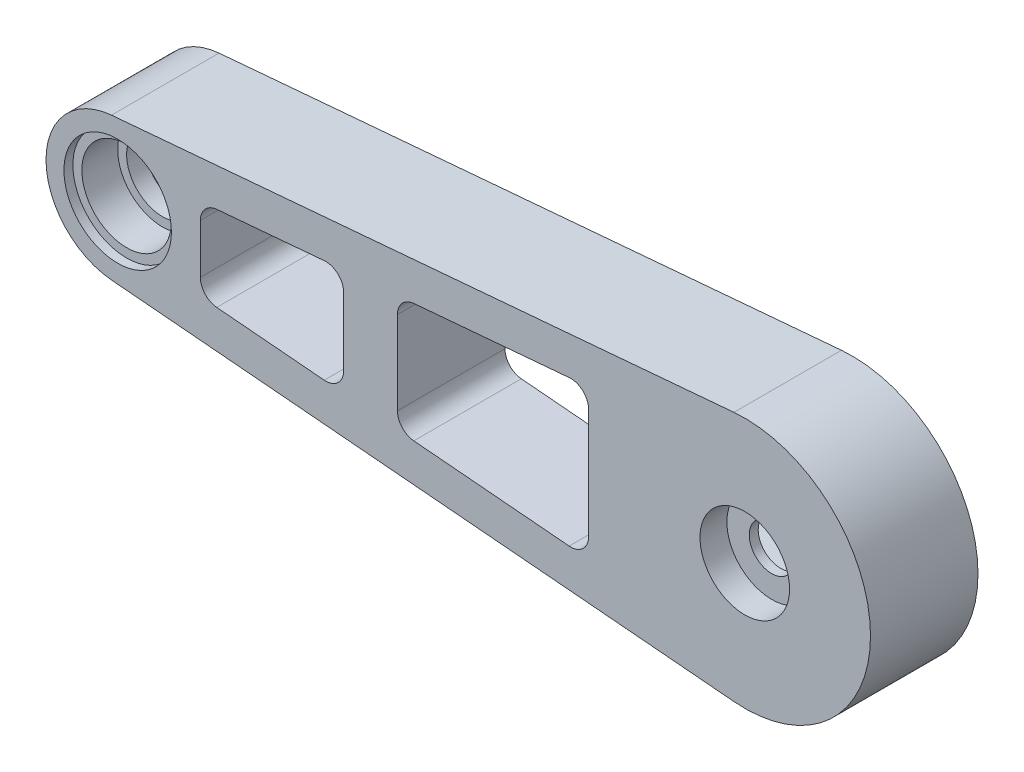
ISO-10303-21;
HEADER;
FILE_DESCRIPTION(('STEP AP214'),'2;1');
FILE_NAME('part.step','',(''),(''),'','','');
FILE_SCHEMA(('AUTOMOTIVE_DESIGN { 1 0 10303 214 1 1 1 1 }'));
ENDSEC;
DATA;
#1=APPLICATION_CONTEXT('core data for automotive mechanical design processes');
#2=APPLICATION_PROTOCOL_DEFINITION('international standard','automotive_design',2000,#1);
#3=PRODUCT_CONTEXT('',#1,'mechanical');
#4=PRODUCT('Part','Part','',(#3));
#5=PRODUCT_RELATED_PRODUCT_CATEGORY('part','',(#4));
#6=PRODUCT_DEFINITION_FORMATION('','',#4);
#7=PRODUCT_DEFINITION_CONTEXT('part definition',#1,'design');
#8=PRODUCT_DEFINITION('design','',#6,#7);
#9=PRODUCT_DEFINITION_SHAPE('','',#8);
#10=(LENGTH_UNIT() NAMED_UNIT(*) SI_UNIT(.MILLI.,.METRE.));
#11=(NAMED_UNIT(*) PLANE_ANGLE_UNIT() SI_UNIT($,.RADIAN.));
#12=(NAMED_UNIT(*) SI_UNIT($,.STERADIAN.) SOLID_ANGLE_UNIT());
#13=UNCERTAINTY_MEASURE_WITH_UNIT(LENGTH_MEASURE(1.E-05),#10,'distance_accuracy_value','');
#14=(GEOMETRIC_REPRESENTATION_CONTEXT(3) GLOBAL_UNCERTAINTY_ASSIGNED_CONTEXT((#13)) GLOBAL_UNIT_ASSIGNED_CONTEXT((#10,
#11,#12)) REPRESENTATION_CONTEXT('',''));
#15=CARTESIAN_POINT('',(0.,0.,0.));
#16=DIRECTION('',(0.,0.,1.));
#17=DIRECTION('',(1.,0.,0.));
#18=AXIS2_PLACEMENT_3D('',#15,#16,#17);
#19=CARTESIAN_POINT('',(-35.,0.,2.5));
#20=DIRECTION('',(0.,0.,-1.));
#21=DIRECTION('',(-1.,0.,0.));
#22=AXIS2_PLACEMENT_3D('',#19,#20,#21);
#23=CYLINDRICAL_SURFACE('',#22,2.5);
#24=CARTESIAN_POINT('',(-35.,0.,2.5));
#25=DIRECTION('',(0.,0.,-1.));
#26=DIRECTION('',(-1.,0.,0.));
#27=AXIS2_PLACEMENT_3D('',#24,#25,#26);
#28=CIRCLE('',#27,2.5);
#29=CARTESIAN_POINT('',(-37.5,0.,2.5));
#30=VERTEX_POINT('',#29);
#31=EDGE_CURVE('E494',#30,#30,#28,.T.);
#32=ORIENTED_EDGE('',*,*,#31,.F.);
#33=EDGE_LOOP('',(#32));
#34=FACE_BOUND('',#33,.T.);
#35=CARTESIAN_POINT('',(-35.,0.,0.5));
#36=DIRECTION('',(0.,0.,-1.));
#37=DIRECTION('',(-1.,0.,0.));
#38=AXIS2_PLACEMENT_3D('',#35,#36,#37);
#39=CIRCLE('',#38,2.5);
#40=CARTESIAN_POINT('',(-37.5,0.,0.5));
#41=VERTEX_POINT('',#40);
#42=EDGE_CURVE('E503',#41,#41,#39,.T.);
#43=ORIENTED_EDGE('',*,*,#42,.T.);
#44=EDGE_LOOP('',(#43));
#45=FACE_BOUND('',#44,.T.);
#46=ADVANCED_FACE('F39',(#34,#45),#23,.F.);
#47=CARTESIAN_POINT('',(-35.,0.,0.));
#48=DIRECTION('',(0.,0.,1.));
#49=DIRECTION('',(1.,0.,0.));
#50=AXIS2_PLACEMENT_3D('',#47,#48,#49);
#51=CYLINDRICAL_SURFACE('',#50,2.);
#52=CARTESIAN_POINT('',(-35.,0.,3.5));
#53=DIRECTION('',(0.,0.,1.));
#54=DIRECTION('',(1.,0.,0.));
#55=AXIS2_PLACEMENT_3D('',#52,#53,#54);
#56=CIRCLE('',#55,2.);
#57=CARTESIAN_POINT('',(-33.,0.,3.5));
#58=VERTEX_POINT('',#57);
#59=EDGE_CURVE('E253',#58,#58,#56,.T.);
#60=ORIENTED_EDGE('',*,*,#59,.T.);
#61=EDGE_LOOP('',(#60));
#62=FACE_BOUND('',#61,.T.);
#63=CARTESIAN_POINT('',(-35.,0.,2.5));
#64=DIRECTION('',(0.,0.,-1.));
#65=DIRECTION('',(-1.,0.,0.));
#66=AXIS2_PLACEMENT_3D('',#63,#64,#65);
#67=CIRCLE('',#66,2.);
#68=CARTESIAN_POINT('',(-37.,0.,2.5));
#69=VERTEX_POINT('',#68);
#70=EDGE_CURVE('E43',#69,#69,#67,.F.);
#71=ORIENTED_EDGE('',*,*,#70,.F.);
#72=EDGE_LOOP('',(#71));
#73=FACE_BOUND('',#72,.T.);
#74=ADVANCED_FACE('F567',(#62,#73),#51,.F.);
#75=CARTESIAN_POINT('',(0.,0.,6.));
#76=DIRECTION('',(0.,0.,-1.));
#77=DIRECTION('',(-1.,0.,0.));
#78=AXIS2_PLACEMENT_3D('',#75,#76,#77);
#79=CYLINDRICAL_SURFACE('',#78,1.25);
#80=CARTESIAN_POINT('',(0.,0.,4.));
#81=DIRECTION('',(0.,0.,-1.));
#82=DIRECTION('',(-1.,0.,0.));
#83=AXIS2_PLACEMENT_3D('',#80,#81,#82);
#84=CIRCLE('',#83,1.25);
#85=CARTESIAN_POINT('',(-1.25,0.,4.));
#86=VERTEX_POINT('',#85);
#87=EDGE_CURVE('E237',#86,#86,#84,.T.);
#88=ORIENTED_EDGE('',*,*,#87,.T.);
#89=EDGE_LOOP('',(#88));
#90=FACE_BOUND('',#89,.T.);
#91=CARTESIAN_POINT('',(0.,0.,4.5));
#92=DIRECTION('',(0.,0.,1.));
#93=DIRECTION('',(1.,0.,0.));
#94=AXIS2_PLACEMENT_3D('',#91,#92,#93);
#95=CIRCLE('',#94,1.25);
#96=CARTESIAN_POINT('',(1.25,0.,4.5));
#97=VERTEX_POINT('',#96);
#98=EDGE_CURVE('E476',#97,#97,#95,.F.);
#99=ORIENTED_EDGE('',*,*,#98,.F.);
#100=EDGE_LOOP('',(#99));
#101=FACE_BOUND('',#100,.T.);
#102=ADVANCED_FACE('F573',(#90,#101),#79,.F.);
#103=CARTESIAN_POINT('',(-35.,0.,3.5));
#104=DIRECTION('',(0.,0.,1.));
#105=DIRECTION('',(1.,0.,0.));
#106=AXIS2_PLACEMENT_3D('',#103,#104,#105);
#107=CYLINDRICAL_SURFACE('',#106,2.5);
#108=CARTESIAN_POINT('',(-35.,0.,3.5));
#109=DIRECTION('',(0.,0.,1.));
#110=DIRECTION('',(1.,0.,0.));
#111=AXIS2_PLACEMENT_3D('',#108,#109,#110);
#112=CIRCLE('',#111,2.5);
#113=CARTESIAN_POINT('',(-32.5,0.,3.5));
#114=VERTEX_POINT('',#113);
#115=EDGE_CURVE('E260',#114,#114,#112,.T.);
#116=ORIENTED_EDGE('',*,*,#115,.F.);
#117=EDGE_LOOP('',(#116));
#118=FACE_BOUND('',#117,.T.);
#119=CARTESIAN_POINT('',(-35.,0.,5.5));
#120=DIRECTION('',(0.,0.,1.));
#121=DIRECTION('',(1.,0.,0.));
#122=AXIS2_PLACEMENT_3D('',#119,#120,#121);
#123=CIRCLE('',#122,2.5);
#124=CARTESIAN_POINT('',(-32.5,0.,5.5));
#125=VERTEX_POINT('',#124);
#126=EDGE_CURVE('E245',#125,#125,#123,.T.);
#127=ORIENTED_EDGE('',*,*,#126,.T.);
#128=EDGE_LOOP('',(#127));
#129=FACE_BOUND('',#128,.T.);
#130=ADVANCED_FACE('F588',(#118,#129),#107,.F.);
#131=CARTESIAN_POINT('',(-35.,0.,6.));
#132=DIRECTION('',(0.,0.,-1.));
#133=DIRECTION('',(-1.,0.,0.));
#134=AXIS2_PLACEMENT_3D('',#131,#132,#133);
#135=CYLINDRICAL_SURFACE('',#134,4.);
#136=CARTESIAN_POINT('',(-35.,0.,0.));
#137=DIRECTION('',(0.,0.,1.));
#138=DIRECTION('',(1.,0.,0.));
#139=AXIS2_PLACEMENT_3D('',#136,#137,#138);
#140=CIRCLE('',#139,4.);
#141=CARTESIAN_POINT('',(-35.3447567805748,3.98511515043765,0.));
#142=VERTEX_POINT('',#141);
#143=CARTESIAN_POINT('',(-35.3447567805748,-3.98511515043766,0.));
#144=VERTEX_POINT('',#143);
#145=EDGE_CURVE('E281',#142,#144,#140,.T.);
#146=ORIENTED_EDGE('',*,*,#145,.T.);
#147=DIRECTION('',(0.,0.,-1.));
#148=VECTOR('',#147,1.);
#149=CARTESIAN_POINT('',(-35.3447567805748,-3.98511515043766,6.));
#150=LINE('',#149,#148);
#151=CARTESIAN_POINT('',(-35.3447567805748,-3.98511515043766,6.));
#152=VERTEX_POINT('',#151);
#153=EDGE_CURVE('E365',#152,#144,#150,.T.);
#154=ORIENTED_EDGE('',*,*,#153,.F.);
#155=CARTESIAN_POINT('',(-35.,0.,6.));
#156=DIRECTION('',(0.,0.,1.));
#157=DIRECTION('',(1.,0.,0.));
#158=AXIS2_PLACEMENT_3D('',#155,#156,#157);
#159=CIRCLE('',#158,4.);
#160=CARTESIAN_POINT('',(-35.3447567805748,3.98511515043765,6.));
#161=VERTEX_POINT('',#160);
#162=EDGE_CURVE('E328',#161,#152,#159,.T.);
#163=ORIENTED_EDGE('',*,*,#162,.F.);
#164=DIRECTION('',(0.,0.,-1.));
#165=VECTOR('',#164,1.);
#166=CARTESIAN_POINT('',(-35.3447567805748,3.98511515043765,6.));
#167=LINE('',#166,#165);
#168=EDGE_CURVE('E342',#161,#142,#167,.T.);
#169=ORIENTED_EDGE('',*,*,#168,.T.);
#170=EDGE_LOOP('',(#146,#154,#163,#169));
#171=FACE_BOUND('',#170,.T.);
#172=ADVANCED_FACE('F542',(#171),#135,.T.);
#173=CARTESIAN_POINT('',(-35.3447567805748,-3.98511515043766,6.));
#174=DIRECTION('',(0.0861891951436873,0.996278787609414,0.));
#175=DIRECTION('',(-0.996278787609414,0.0861891951436873,0.));
#176=AXIS2_PLACEMENT_3D('',#173,#174,#175);
#177=PLANE('',#176);
#178=DIRECTION('',(0.996278787609414,-0.0861891951436873,0.));
#179=VECTOR('',#178,1.);
#180=CARTESIAN_POINT('',(-35.3447567805748,-3.98511515043766,0.));
#181=LINE('',#180,#179);
#182=CARTESIAN_POINT('',(-0.604756988157837,-6.99051148993509,0.));
#183=VERTEX_POINT('',#182);
#184=EDGE_CURVE('E346',#144,#183,#181,.T.);
#185=ORIENTED_EDGE('',*,*,#184,.T.);
#186=DIRECTION('',(0.,0.,-1.));
#187=VECTOR('',#186,1.);
#188=CARTESIAN_POINT('',(-0.604756988157837,-6.99051148993509,6.));
#189=LINE('',#188,#187);
#190=CARTESIAN_POINT('',(-0.604756988157837,-6.99051148993509,6.));
#191=VERTEX_POINT('',#190);
#192=EDGE_CURVE('E361',#191,#183,#189,.T.);
#193=ORIENTED_EDGE('',*,*,#192,.F.);
#194=DIRECTION('',(0.996278787609414,-0.0861891951436873,0.));
#195=VECTOR('',#194,1.);
#196=CARTESIAN_POINT('',(-35.3447567805748,-3.98511515043766,6.));
#197=LINE('',#196,#195);
#198=EDGE_CURVE('E332',#152,#191,#197,.T.);
#199=ORIENTED_EDGE('',*,*,#198,.F.);
#200=ORIENTED_EDGE('',*,*,#153,.T.);
#201=EDGE_LOOP('',(#185,#193,#199,#200));
#202=FACE_BOUND('',#201,.T.);
#203=ADVANCED_FACE('F554',(#202),#177,.F.);
#204=CARTESIAN_POINT('',(0.,0.,6.));
#205=DIRECTION('',(0.,0.,-1.));
#206=DIRECTION('',(-1.,0.,0.));
#207=AXIS2_PLACEMENT_3D('',#204,#205,#206);
#208=CYLINDRICAL_SURFACE('',#207,7.01662183002906);
#209=CARTESIAN_POINT('',(0.,0.,0.));
#210=DIRECTION('',(0.,0.,1.));
#211=DIRECTION('',(1.,0.,0.));
#212=AXIS2_PLACEMENT_3D('',#209,#210,#211);
#213=CIRCLE('',#212,7.01662183002906);
#214=CARTESIAN_POINT('',(-0.604756988157831,6.99051148993509,0.));
#215=VERTEX_POINT('',#214);
#216=EDGE_CURVE('E349',#183,#215,#213,.T.);
#217=ORIENTED_EDGE('',*,*,#216,.T.);
#218=DIRECTION('',(0.,0.,-1.));
#219=VECTOR('',#218,1.);
#220=CARTESIAN_POINT('',(-0.604756988157831,6.99051148993509,6.));
#221=LINE('',#220,#219);
#222=CARTESIAN_POINT('',(-0.604756988157831,6.99051148993509,6.));
#223=VERTEX_POINT('',#222);
#224=EDGE_CURVE('E357',#223,#215,#221,.T.);
#225=ORIENTED_EDGE('',*,*,#224,.F.);
#226=CARTESIAN_POINT('',(0.,0.,6.));
#227=DIRECTION('',(0.,0.,1.));
#228=DIRECTION('',(1.,0.,0.));
#229=AXIS2_PLACEMENT_3D('',#226,#227,#228);
#230=CIRCLE('',#229,7.01662183002906);
#231=EDGE_CURVE('E336',#191,#223,#230,.T.);
#232=ORIENTED_EDGE('',*,*,#231,.F.);
#233=ORIENTED_EDGE('',*,*,#192,.T.);
#234=EDGE_LOOP('',(#217,#225,#232,#233));
#235=FACE_BOUND('',#234,.T.);
#236=ADVANCED_FACE('F551',(#235),#208,.T.);
#237=CARTESIAN_POINT('',(-35.3447567805748,3.98511515043765,6.));
#238=DIRECTION('',(0.0861891951436873,-0.996278787609414,0.));
#239=DIRECTION('',(0.996278787609414,0.0861891951436873,0.));
#240=AXIS2_PLACEMENT_3D('',#237,#238,#239);
#241=PLANE('',#240);
#242=DIRECTION('',(-0.996278787609414,-0.0861891951436873,0.));
#243=VECTOR('',#242,1.);
#244=CARTESIAN_POINT('',(-35.3447567805748,3.98511515043765,0.));
#245=LINE('',#244,#243);
#246=EDGE_CURVE('E333',#215,#142,#245,.T.);
#247=ORIENTED_EDGE('',*,*,#246,.T.);
#248=ORIENTED_EDGE('',*,*,#168,.F.);
#249=DIRECTION('',(-0.996278787609414,-0.0861891951436873,0.));
#250=VECTOR('',#249,1.);
#251=CARTESIAN_POINT('',(-35.3447567805748,3.98511515043765,6.));
#252=LINE('',#251,#250);
#253=EDGE_CURVE('E339',#223,#161,#252,.T.);
#254=ORIENTED_EDGE('',*,*,#253,.F.);
#255=ORIENTED_EDGE('',*,*,#224,.T.);
#256=EDGE_LOOP('',(#247,#248,#254,#255));
#257=FACE_BOUND('',#256,.T.);
#258=ADVANCED_FACE('F547',(#257),#241,.F.);
#259=CARTESIAN_POINT('',(-35.,0.,6.));
#260=DIRECTION('',(0.,0.,1.));
#261=DIRECTION('',(1.,0.,0.));
#262=AXIS2_PLACEMENT_3D('',#259,#260,#261);
#263=PLANE('',#262);
#264=CARTESIAN_POINT('',(0.,0.,6.));
#265=DIRECTION('',(0.,0.,1.));
#266=DIRECTION('',(1.,0.,0.));
#267=AXIS2_PLACEMENT_3D('',#264,#265,#266);
#268=CIRCLE('',#267,2.5);
#269=CARTESIAN_POINT('',(2.5,0.,6.));
#270=VERTEX_POINT('',#269);
#271=EDGE_CURVE('E486',#270,#270,#268,.T.);
#272=ORIENTED_EDGE('',*,*,#271,.F.);
#273=EDGE_LOOP('',(#272));
#274=FACE_BOUND('',#273,.T.);
#275=CARTESIAN_POINT('',(-35.,0.,6.));
#276=DIRECTION('',(0.,0.,1.));
#277=DIRECTION('',(1.,0.,0.));
#278=AXIS2_PLACEMENT_3D('',#275,#276,#277);
#279=CIRCLE('',#278,3.);
#280=CARTESIAN_POINT('',(-32.,0.,6.));
#281=VERTEX_POINT('',#280);
#282=EDGE_CURVE('E243',#281,#281,#279,.T.);
#283=ORIENTED_EDGE('',*,*,#282,.F.);
#284=EDGE_LOOP('',(#283));
#285=FACE_BOUND('',#284,.T.);
#286=DIRECTION('',(0.,-1.,0.));
#287=VECTOR('',#286,1.);
#288=CARTESIAN_POINT('',(-30.3859956521314,2.2911257053235,6.));
#289=LINE('',#288,#287);
#290=CARTESIAN_POINT('',(-30.3859956521314,1.37390171519016,6.));
#291=VERTEX_POINT('',#290);
#292=CARTESIAN_POINT('',(-30.3859956521314,-1.37390171519016,6.));
#293=VERTEX_POINT('',#292);
#294=EDGE_CURVE('E282',#291,#293,#289,.T.);
#295=ORIENTED_EDGE('',*,*,#294,.F.);
#296=CARTESIAN_POINT('',(-29.3859956521314,1.37390171519016,6.));
#297=DIRECTION('',(0.,0.,1.));
#298=DIRECTION('',(1.,0.,0.));
#299=AXIS2_PLACEMENT_3D('',#296,#297,#298);
#300=CIRCLE('',#299,1.);
#301=CARTESIAN_POINT('',(-29.472184847275,2.37018050279957,6.));
#302=VERTEX_POINT('',#301);
#303=EDGE_CURVE('E467',#291,#302,#300,.F.);
#304=ORIENTED_EDGE('',*,*,#303,.T.);
#305=DIRECTION('',(-0.996278787609414,-0.0861891951436875,0.));
#306=VECTOR('',#305,1.);
#307=CARTESIAN_POINT('',(-30.3859956521314,2.2911257053235,6.));
#308=LINE('',#307,#306);
#309=CARTESIAN_POINT('',(-23.472184847275,2.88924723120297,6.));
#310=VERTEX_POINT('',#309);
#311=EDGE_CURVE('E269',#310,#302,#308,.T.);
#312=ORIENTED_EDGE('',*,*,#311,.F.);
#313=CARTESIAN_POINT('',(-23.3859956521314,1.89296844359356,6.));
#314=DIRECTION('',(0.,0.,1.));
#315=DIRECTION('',(1.,0.,0.));
#316=AXIS2_PLACEMENT_3D('',#313,#314,#315);
#317=CIRCLE('',#316,1.);
#318=CARTESIAN_POINT('',(-22.3859956521314,1.89296844359356,6.));
#319=VERTEX_POINT('',#318);
#320=EDGE_CURVE('E455',#310,#319,#317,.F.);
#321=ORIENTED_EDGE('',*,*,#320,.T.);
#322=DIRECTION('',(0.,1.,0.));
#323=VECTOR('',#322,1.);
#324=CARTESIAN_POINT('',(-22.3859956521314,2.98321467652803,6.));
#325=LINE('',#324,#323);
#326=CARTESIAN_POINT('',(-22.3859956521314,-1.89296844359356,6.));
#327=VERTEX_POINT('',#326);
#328=EDGE_CURVE('E290',#327,#319,#325,.T.);
#329=ORIENTED_EDGE('',*,*,#328,.F.);
#330=CARTESIAN_POINT('',(-23.3859956521314,-1.89296844359356,6.));
#331=DIRECTION('',(0.,0.,1.));
#332=DIRECTION('',(1.,0.,0.));
#333=AXIS2_PLACEMENT_3D('',#330,#331,#332);
#334=CIRCLE('',#333,1.);
#335=CARTESIAN_POINT('',(-23.472184847275,-2.88924723120297,6.));
#336=VERTEX_POINT('',#335);
#337=EDGE_CURVE('E449',#327,#336,#334,.F.);
#338=ORIENTED_EDGE('',*,*,#337,.T.);
#339=DIRECTION('',(0.996278787609414,-0.0861891951436873,0.));
#340=VECTOR('',#339,1.);
#341=CARTESIAN_POINT('',(-30.3859956521314,-2.2911257053235,6.));
#342=LINE('',#341,#340);
#343=CARTESIAN_POINT('',(-29.472184847275,-2.37018050279957,6.));
#344=VERTEX_POINT('',#343);
#345=EDGE_CURVE('E285',#344,#336,#342,.T.);
#346=ORIENTED_EDGE('',*,*,#345,.F.);
#347=CARTESIAN_POINT('',(-29.3859956521314,-1.37390171519016,6.));
#348=DIRECTION('',(0.,0.,1.));
#349=DIRECTION('',(1.,0.,0.));
#350=AXIS2_PLACEMENT_3D('',#347,#348,#349);
#351=CIRCLE('',#350,1.);
#352=EDGE_CURVE('E461',#344,#293,#351,.F.);
#353=ORIENTED_EDGE('',*,*,#352,.T.);
#354=EDGE_LOOP('',(#295,#304,#312,#321,#329,#338,#346,#353));
#355=FACE_BOUND('',#354,.T.);
#356=DIRECTION('',(0.996278787609414,-0.0861891951436873,0.));
#357=VECTOR('',#356,1.);
#358=CARTESIAN_POINT('',(-19.3859956521314,-3.24274804072973,6.));
#359=LINE('',#358,#357);
#360=CARTESIAN_POINT('',(-18.472184847275,-3.32180283820581,6.));
#361=VERTEX_POINT('',#360);
#362=CARTESIAN_POINT('',(-9.80184128553351,-4.07188398266025,6.));
#363=VERTEX_POINT('',#362);
#364=EDGE_CURVE('E264',#361,#363,#359,.T.);
#365=ORIENTED_EDGE('',*,*,#364,.F.);
#366=CARTESIAN_POINT('',(-18.3859956521314,-2.32552405059639,6.));
#367=DIRECTION('',(0.,0.,1.));
#368=DIRECTION('',(1.,0.,0.));
#369=AXIS2_PLACEMENT_3D('',#366,#367,#368);
#370=CIRCLE('',#369,1.);
#371=CARTESIAN_POINT('',(-19.3859956521314,-2.32552405059639,6.));
#372=VERTEX_POINT('',#371);
#373=EDGE_CURVE('E437',#361,#372,#370,.F.);
#374=ORIENTED_EDGE('',*,*,#373,.T.);
#375=DIRECTION('',(0.,-1.,0.));
#376=VECTOR('',#375,1.);
#377=CARTESIAN_POINT('',(-19.3859956521314,3.24274804072973,6.));
#378=LINE('',#377,#376);
#379=CARTESIAN_POINT('',(-19.3859956521314,2.32552405059639,6.));
#380=VERTEX_POINT('',#379);
#381=EDGE_CURVE('E302',#380,#372,#378,.T.);
#382=ORIENTED_EDGE('',*,*,#381,.F.);
#383=CARTESIAN_POINT('',(-18.3859956521314,2.32552405059639,6.));
#384=DIRECTION('',(0.,0.,1.));
#385=DIRECTION('',(1.,0.,0.));
#386=AXIS2_PLACEMENT_3D('',#383,#384,#385);
#387=CIRCLE('',#386,1.);
#388=CARTESIAN_POINT('',(-18.472184847275,3.32180283820581,6.));
#389=VERTEX_POINT('',#388);
#390=EDGE_CURVE('E443',#380,#389,#387,.F.);
#391=ORIENTED_EDGE('',*,*,#390,.T.);
#392=DIRECTION('',(-0.996278787609414,-0.0861891951436875,0.));
#393=VECTOR('',#392,1.);
#394=CARTESIAN_POINT('',(-19.3859956521314,3.24274804072973,6.));
#395=LINE('',#394,#393);
#396=CARTESIAN_POINT('',(-9.80184128553351,4.07188398266025,6.));
#397=VERTEX_POINT('',#396);
#398=EDGE_CURVE('E321',#397,#389,#395,.T.);
#399=ORIENTED_EDGE('',*,*,#398,.F.);
#400=CARTESIAN_POINT('',(-9.71565209038982,3.07560519505084,6.));
#401=DIRECTION('',(0.,0.,1.));
#402=DIRECTION('',(1.,0.,0.));
#403=AXIS2_PLACEMENT_3D('',#400,#401,#402);
#404=CIRCLE('',#403,1.);
#405=CARTESIAN_POINT('',(-8.71565209038982,3.07560519505084,6.));
#406=VERTEX_POINT('',#405);
#407=EDGE_CURVE('E431',#397,#406,#404,.F.);
#408=ORIENTED_EDGE('',*,*,#407,.T.);
#409=DIRECTION('',(0.,1.,0.));
#410=VECTOR('',#409,1.);
#411=CARTESIAN_POINT('',(-8.71565209038982,4.16585142798531,6.));
#412=LINE('',#411,#410);
#413=CARTESIAN_POINT('',(-8.71565209038982,-3.07560519505083,6.));
#414=VERTEX_POINT('',#413);
#415=EDGE_CURVE('E317',#414,#406,#412,.T.);
#416=ORIENTED_EDGE('',*,*,#415,.F.);
#417=CARTESIAN_POINT('',(-9.71565209038982,-3.07560519505083,6.));
#418=DIRECTION('',(0.,0.,1.));
#419=DIRECTION('',(1.,0.,0.));
#420=AXIS2_PLACEMENT_3D('',#417,#418,#419);
#421=CIRCLE('',#420,1.);
#422=EDGE_CURVE('E425',#414,#363,#421,.F.);
#423=ORIENTED_EDGE('',*,*,#422,.T.);
#424=EDGE_LOOP('',(#365,#374,#382,#391,#399,#408,#416,#423));
#425=FACE_BOUND('',#424,.T.);
#426=ORIENTED_EDGE('',*,*,#162,.T.);
#427=ORIENTED_EDGE('',*,*,#198,.T.);
#428=ORIENTED_EDGE('',*,*,#231,.T.);
#429=ORIENTED_EDGE('',*,*,#253,.T.);
#430=EDGE_LOOP('',(#426,#427,#428,#429));
#431=FACE_BOUND('',#430,.T.);
#432=ADVANCED_FACE('F529',(#274,#285,#355,#425,#431),#263,.T.);
#433=CARTESIAN_POINT('',(-35.,0.,0.));
#434=DIRECTION('',(0.,0.,1.));
#435=DIRECTION('',(1.,0.,0.));
#436=AXIS2_PLACEMENT_3D('',#433,#434,#435);
#437=PLANE('',#436);
#438=CARTESIAN_POINT('',(-35.,0.,0.));
#439=DIRECTION('',(0.,0.,-1.));
#440=DIRECTION('',(-1.,0.,0.));
#441=AXIS2_PLACEMENT_3D('',#438,#439,#440);
#442=CIRCLE('',#441,3.);
#443=CARTESIAN_POINT('',(-38.,0.,0.));
#444=VERTEX_POINT('',#443);
#445=EDGE_CURVE('E499',#444,#444,#442,.T.);
#446=ORIENTED_EDGE('',*,*,#445,.F.);
#447=EDGE_LOOP('',(#446));
#448=FACE_BOUND('',#447,.T.);
#449=DIRECTION('',(0.,1.,0.));
#450=VECTOR('',#449,1.);
#451=CARTESIAN_POINT('',(-22.3859956521314,2.98321467652803,0.));
#452=LINE('',#451,#450);
#453=CARTESIAN_POINT('',(-22.3859956521314,-1.89296844359356,0.));
#454=VERTEX_POINT('',#453);
#455=CARTESIAN_POINT('',(-22.3859956521314,1.89296844359356,0.));
#456=VERTEX_POINT('',#455);
#457=EDGE_CURVE('E273',#454,#456,#452,.T.);
#458=ORIENTED_EDGE('',*,*,#457,.T.);
#459=CARTESIAN_POINT('',(-23.3859956521314,1.89296844359356,0.));
#460=DIRECTION('',(0.,0.,1.));
#461=DIRECTION('',(1.,0.,0.));
#462=AXIS2_PLACEMENT_3D('',#459,#460,#461);
#463=CIRCLE('',#462,1.);
#464=CARTESIAN_POINT('',(-23.472184847275,2.88924723120297,0.));
#465=VERTEX_POINT('',#464);
#466=EDGE_CURVE('E458',#456,#465,#463,.T.);
#467=ORIENTED_EDGE('',*,*,#466,.T.);
#468=DIRECTION('',(-0.996278787609414,-0.0861891951436875,0.));
#469=VECTOR('',#468,1.);
#470=CARTESIAN_POINT('',(-30.3859956521314,2.2911257053235,0.));
#471=LINE('',#470,#469);
#472=CARTESIAN_POINT('',(-29.472184847275,2.37018050279957,0.));
#473=VERTEX_POINT('',#472);
#474=EDGE_CURVE('E277',#465,#473,#471,.T.);
#475=ORIENTED_EDGE('',*,*,#474,.T.);
#476=CARTESIAN_POINT('',(-29.3859956521314,1.37390171519016,0.));
#477=DIRECTION('',(0.,0.,1.));
#478=DIRECTION('',(1.,0.,0.));
#479=AXIS2_PLACEMENT_3D('',#476,#477,#478);
#480=CIRCLE('',#479,1.);
#481=CARTESIAN_POINT('',(-30.3859956521314,1.37390171519016,0.));
#482=VERTEX_POINT('',#481);
#483=EDGE_CURVE('E470',#473,#482,#480,.T.);
#484=ORIENTED_EDGE('',*,*,#483,.T.);
#485=DIRECTION('',(0.,-1.,0.));
#486=VECTOR('',#485,1.);
#487=CARTESIAN_POINT('',(-30.3859956521314,2.2911257053235,0.));
#488=LINE('',#487,#486);
#489=CARTESIAN_POINT('',(-30.3859956521314,-1.37390171519016,0.));
#490=VERTEX_POINT('',#489);
#491=EDGE_CURVE('E265',#482,#490,#488,.T.);
#492=ORIENTED_EDGE('',*,*,#491,.T.);
#493=CARTESIAN_POINT('',(-29.3859956521314,-1.37390171519016,0.));
#494=DIRECTION('',(0.,0.,1.));
#495=DIRECTION('',(1.,0.,0.));
#496=AXIS2_PLACEMENT_3D('',#493,#494,#495);
#497=CIRCLE('',#496,1.);
#498=CARTESIAN_POINT('',(-29.472184847275,-2.37018050279957,0.));
#499=VERTEX_POINT('',#498);
#500=EDGE_CURVE('E464',#490,#499,#497,.T.);
#501=ORIENTED_EDGE('',*,*,#500,.T.);
#502=DIRECTION('',(0.996278787609414,-0.0861891951436873,0.));
#503=VECTOR('',#502,1.);
#504=CARTESIAN_POINT('',(-30.3859956521314,-2.2911257053235,0.));
#505=LINE('',#504,#503);
#506=CARTESIAN_POINT('',(-23.472184847275,-2.88924723120297,0.));
#507=VERTEX_POINT('',#506);
#508=EDGE_CURVE('E268',#499,#507,#505,.T.);
#509=ORIENTED_EDGE('',*,*,#508,.T.);
#510=CARTESIAN_POINT('',(-23.3859956521314,-1.89296844359356,0.));
#511=DIRECTION('',(0.,0.,1.));
#512=DIRECTION('',(1.,0.,0.));
#513=AXIS2_PLACEMENT_3D('',#510,#511,#512);
#514=CIRCLE('',#513,1.);
#515=EDGE_CURVE('E452',#507,#454,#514,.T.);
#516=ORIENTED_EDGE('',*,*,#515,.T.);
#517=EDGE_LOOP('',(#458,#467,#475,#484,#492,#501,#509,#516));
#518=FACE_BOUND('',#517,.T.);
#519=DIRECTION('',(0.,1.,0.));
#520=VECTOR('',#519,1.);
#521=CARTESIAN_POINT('',(-8.71565209038982,4.16585142798531,0.));
#522=LINE('',#521,#520);
#523=CARTESIAN_POINT('',(-8.71565209038982,-3.07560519505083,0.));
#524=VERTEX_POINT('',#523);
#525=CARTESIAN_POINT('',(-8.71565209038982,-2.42959946499414,0.));
#526=VERTEX_POINT('',#525);
#527=EDGE_CURVE('E303',#524,#526,#522,.T.);
#528=ORIENTED_EDGE('',*,*,#527,.T.);
#529=DIRECTION('',(-0.992156741649222,0.125,0.));
#530=VECTOR('',#529,1.);
#531=CARTESIAN_POINT('',(-12.25,-1.98431348329844,0.));
#532=LINE('',#531,#530);
#533=CARTESIAN_POINT('',(-0.437499999999999,-3.47254859577227,0.));
#534=VERTEX_POINT('',#533);
#535=EDGE_CURVE('E214',#534,#526,#532,.T.);
#536=ORIENTED_EDGE('',*,*,#535,.F.);
#537=CARTESIAN_POINT('',(0.,0.,0.));
#538=DIRECTION('',(0.,0.,-1.));
#539=DIRECTION('',(-1.,0.,0.));
#540=AXIS2_PLACEMENT_3D('',#537,#538,#539);
#541=CIRCLE('',#540,3.5);
#542=CARTESIAN_POINT('',(-0.4375,3.47254859577227,0.));
#543=VERTEX_POINT('',#542);
#544=EDGE_CURVE('E236',#543,#534,#541,.T.);
#545=ORIENTED_EDGE('',*,*,#544,.F.);
#546=DIRECTION('',(0.992156741649222,0.125,0.));
#547=VECTOR('',#546,1.);
#548=CARTESIAN_POINT('',(-12.25,1.98431348329844,0.));
#549=LINE('',#548,#547);
#550=CARTESIAN_POINT('',(-8.71565209038982,2.42959946499413,0.));
#551=VERTEX_POINT('',#550);
#552=EDGE_CURVE('E220',#551,#543,#549,.T.);
#553=ORIENTED_EDGE('',*,*,#552,.F.);
#554=CARTESIAN_POINT('',(-8.71565209038982,3.07560519505084,0.));
#555=VERTEX_POINT('',#554);
#556=EDGE_CURVE('E301',#551,#555,#522,.T.);
#557=ORIENTED_EDGE('',*,*,#556,.T.);
#558=CARTESIAN_POINT('',(-9.71565209038982,3.07560519505084,0.));
#559=DIRECTION('',(0.,0.,1.));
#560=DIRECTION('',(1.,0.,0.));
#561=AXIS2_PLACEMENT_3D('',#558,#559,#560);
#562=CIRCLE('',#561,1.);
#563=CARTESIAN_POINT('',(-9.80184128553351,4.07188398266025,0.));
#564=VERTEX_POINT('',#563);
#565=EDGE_CURVE('E434',#555,#564,#562,.T.);
#566=ORIENTED_EDGE('',*,*,#565,.T.);
#567=DIRECTION('',(-0.996278787609414,-0.0861891951436875,0.));
#568=VECTOR('',#567,1.);
#569=CARTESIAN_POINT('',(-19.3859956521314,3.24274804072973,0.));
#570=LINE('',#569,#568);
#571=CARTESIAN_POINT('',(-18.472184847275,3.32180283820581,0.));
#572=VERTEX_POINT('',#571);
#573=EDGE_CURVE('E307',#564,#572,#570,.T.);
#574=ORIENTED_EDGE('',*,*,#573,.T.);
#575=CARTESIAN_POINT('',(-18.3859956521314,2.32552405059639,0.));
#576=DIRECTION('',(0.,0.,1.));
#577=DIRECTION('',(1.,0.,0.));
#578=AXIS2_PLACEMENT_3D('',#575,#576,#577);
#579=CIRCLE('',#578,1.);
#580=CARTESIAN_POINT('',(-19.3859956521314,2.32552405059639,0.));
#581=VERTEX_POINT('',#580);
#582=EDGE_CURVE('E446',#572,#581,#579,.T.);
#583=ORIENTED_EDGE('',*,*,#582,.T.);
#584=DIRECTION('',(0.,-1.,0.));
#585=VECTOR('',#584,1.);
#586=CARTESIAN_POINT('',(-19.3859956521314,3.24274804072973,0.));
#587=LINE('',#586,#585);
#588=CARTESIAN_POINT('',(-19.3859956521314,-2.32552405059639,0.));
#589=VERTEX_POINT('',#588);
#590=EDGE_CURVE('E286',#581,#589,#587,.T.);
#591=ORIENTED_EDGE('',*,*,#590,.T.);
#592=CARTESIAN_POINT('',(-18.3859956521314,-2.32552405059639,0.));
#593=DIRECTION('',(0.,0.,1.));
#594=DIRECTION('',(1.,0.,0.));
#595=AXIS2_PLACEMENT_3D('',#592,#593,#594);
#596=CIRCLE('',#595,1.);
#597=CARTESIAN_POINT('',(-18.472184847275,-3.32180283820581,0.));
#598=VERTEX_POINT('',#597);
#599=EDGE_CURVE('E440',#589,#598,#596,.T.);
#600=ORIENTED_EDGE('',*,*,#599,.T.);
#601=DIRECTION('',(0.996278787609414,-0.0861891951436873,0.));
#602=VECTOR('',#601,1.);
#603=CARTESIAN_POINT('',(-19.3859956521314,-3.24274804072973,0.));
#604=LINE('',#603,#602);
#605=CARTESIAN_POINT('',(-9.80184128553351,-4.07188398266025,0.));
#606=VERTEX_POINT('',#605);
#607=EDGE_CURVE('E297',#598,#606,#604,.T.);
#608=ORIENTED_EDGE('',*,*,#607,.T.);
#609=CARTESIAN_POINT('',(-9.71565209038982,-3.07560519505083,0.));
#610=DIRECTION('',(0.,0.,1.));
#611=DIRECTION('',(1.,0.,0.));
#612=AXIS2_PLACEMENT_3D('',#609,#610,#611);
#613=CIRCLE('',#612,1.);
#614=EDGE_CURVE('E428',#606,#524,#613,.T.);
#615=ORIENTED_EDGE('',*,*,#614,.T.);
#616=EDGE_LOOP('',(#528,#536,#545,#553,#557,#566,#574,#583,#591,#600,#608,#615));
#617=FACE_BOUND('',#616,.T.);
#618=ORIENTED_EDGE('',*,*,#145,.F.);
#619=ORIENTED_EDGE('',*,*,#246,.F.);
#620=ORIENTED_EDGE('',*,*,#216,.F.);
#621=ORIENTED_EDGE('',*,*,#184,.F.);
#622=EDGE_LOOP('',(#618,#619,#620,#621));
#623=FACE_BOUND('',#622,.T.);
#624=ADVANCED_FACE('F525',(#448,#518,#617,#623),#437,.F.);
#625=CARTESIAN_POINT('',(-19.3859956521314,-3.24274804072973,0.));
#626=DIRECTION('',(-0.0861891951436873,-0.996278787609414,0.));
#627=DIRECTION('',(0.996278787609414,-0.0861891951436873,0.));
#628=AXIS2_PLACEMENT_3D('',#625,#626,#627);
#629=PLANE('',#628);
#630=ORIENTED_EDGE('',*,*,#364,.T.);
#631=DIRECTION('',(0.,0.,1.));
#632=VECTOR('',#631,1.);
#633=CARTESIAN_POINT('',(-9.80184128553351,-4.07188398266025,0.));
#634=LINE('',#633,#632);
#635=EDGE_CURVE('E381',#363,#606,#634,.F.);
#636=ORIENTED_EDGE('',*,*,#635,.T.);
#637=ORIENTED_EDGE('',*,*,#607,.F.);
#638=DIRECTION('',(0.,0.,1.));
#639=VECTOR('',#638,1.);
#640=CARTESIAN_POINT('',(-18.472184847275,-3.32180283820581,6.));
#641=LINE('',#640,#639);
#642=EDGE_CURVE('E377',#598,#361,#641,.T.);
#643=ORIENTED_EDGE('',*,*,#642,.T.);
#644=EDGE_LOOP('',(#630,#636,#637,#643));
#645=FACE_BOUND('',#644,.T.);
#646=ADVANCED_FACE('F528',(#645),#629,.F.);
#647=CARTESIAN_POINT('',(-19.3859956521314,3.24274804072973,0.));
#648=DIRECTION('',(-1.,0.,0.));
#649=DIRECTION('',(0.,0.,1.));
#650=AXIS2_PLACEMENT_3D('',#647,#648,#649);
#651=PLANE('',#650);
#652=ORIENTED_EDGE('',*,*,#381,.T.);
#653=DIRECTION('',(0.,0.,1.));
#654=VECTOR('',#653,1.);
#655=CARTESIAN_POINT('',(-19.3859956521314,-2.32552405059639,0.));
#656=LINE('',#655,#654);
#657=EDGE_CURVE('E395',#372,#589,#656,.F.);
#658=ORIENTED_EDGE('',*,*,#657,.T.);
#659=ORIENTED_EDGE('',*,*,#590,.F.);
#660=DIRECTION('',(0.,0.,1.));
#661=VECTOR('',#660,1.);
#662=CARTESIAN_POINT('',(-19.3859956521314,2.32552405059639,6.));
#663=LINE('',#662,#661);
#664=EDGE_CURVE('E391',#581,#380,#663,.T.);
#665=ORIENTED_EDGE('',*,*,#664,.T.);
#666=EDGE_LOOP('',(#652,#658,#659,#665));
#667=FACE_BOUND('',#666,.T.);
#668=ADVANCED_FACE('F633',(#667),#651,.F.);
#669=CARTESIAN_POINT('',(-19.3859956521314,3.24274804072973,0.));
#670=DIRECTION('',(-0.0861891951436875,0.996278787609414,0.));
#671=DIRECTION('',(-0.996278787609414,-0.0861891951436875,0.));
#672=AXIS2_PLACEMENT_3D('',#669,#670,#671);
#673=PLANE('',#672);
#674=ORIENTED_EDGE('',*,*,#573,.F.);
#675=DIRECTION('',(0.,0.,1.));
#676=VECTOR('',#675,1.);
#677=CARTESIAN_POINT('',(-9.80184128553351,4.07188398266025,6.));
#678=LINE('',#677,#676);
#679=EDGE_CURVE('E387',#564,#397,#678,.T.);
#680=ORIENTED_EDGE('',*,*,#679,.T.);
#681=ORIENTED_EDGE('',*,*,#398,.T.);
#682=DIRECTION('',(0.,0.,1.));
#683=VECTOR('',#682,1.);
#684=CARTESIAN_POINT('',(-18.472184847275,3.32180283820581,0.));
#685=LINE('',#684,#683);
#686=EDGE_CURVE('E384',#389,#572,#685,.F.);
#687=ORIENTED_EDGE('',*,*,#686,.T.);
#688=EDGE_LOOP('',(#674,#680,#681,#687));
#689=FACE_BOUND('',#688,.T.);
#690=ADVANCED_FACE('F636',(#689),#673,.F.);
#691=CARTESIAN_POINT('',(-8.71565209038982,4.16585142798531,0.));
#692=DIRECTION('',(1.,0.,0.));
#693=DIRECTION('',(0.,0.,-1.));
#694=AXIS2_PLACEMENT_3D('',#691,#692,#693);
#695=PLANE('',#694);
#696=DIRECTION('',(0.,1.,0.));
#697=VECTOR('',#696,1.);
#698=CARTESIAN_POINT('',(-8.71565209038982,4.16585142798531,4.));
#699=LINE('',#698,#697);
#700=CARTESIAN_POINT('',(-8.71565209038982,-2.42959946499414,4.));
#701=VERTEX_POINT('',#700);
#702=CARTESIAN_POINT('',(-8.71565209038982,2.42959946499413,4.));
#703=VERTEX_POINT('',#702);
#704=EDGE_CURVE('E210',#701,#703,#699,.T.);
#705=ORIENTED_EDGE('',*,*,#704,.F.);
#706=DIRECTION('',(0.,0.,-1.));
#707=VECTOR('',#706,1.);
#708=CARTESIAN_POINT('',(-8.71565209038982,-2.42959946499413,0.));
#709=LINE('',#708,#707);
#710=EDGE_CURVE('E11',#701,#526,#709,.T.);
#711=ORIENTED_EDGE('',*,*,#710,.T.);
#712=ORIENTED_EDGE('',*,*,#527,.F.);
#713=DIRECTION('',(0.,0.,1.));
#714=VECTOR('',#713,1.);
#715=CARTESIAN_POINT('',(-8.71565209038982,-3.07560519505083,6.));
#716=LINE('',#715,#714);
#717=EDGE_CURVE('E373',#524,#414,#716,.T.);
#718=ORIENTED_EDGE('',*,*,#717,.T.);
#719=ORIENTED_EDGE('',*,*,#415,.T.);
#720=DIRECTION('',(0.,0.,1.));
#721=VECTOR('',#720,1.);
#722=CARTESIAN_POINT('',(-8.71565209038982,3.07560519505084,0.));
#723=LINE('',#722,#721);
#724=EDGE_CURVE('E369',#406,#555,#723,.F.);
#725=ORIENTED_EDGE('',*,*,#724,.T.);
#726=ORIENTED_EDGE('',*,*,#556,.F.);
#727=DIRECTION('',(0.,0.,1.));
#728=VECTOR('',#727,1.);
#729=CARTESIAN_POINT('',(-8.71565209038982,2.42959946499413,0.));
#730=LINE('',#729,#728);
#731=EDGE_CURVE('E49',#551,#703,#730,.T.);
#732=ORIENTED_EDGE('',*,*,#731,.T.);
#733=EDGE_LOOP('',(#705,#711,#712,#718,#719,#725,#726,#732));
#734=FACE_BOUND('',#733,.T.);
#735=ADVANCED_FACE('F632',(#734),#695,.F.);
#736=CARTESIAN_POINT('',(-30.3859956521314,2.2911257053235,0.));
#737=DIRECTION('',(-1.,0.,0.));
#738=DIRECTION('',(0.,0.,1.));
#739=AXIS2_PLACEMENT_3D('',#736,#737,#738);
#740=PLANE('',#739);
#741=ORIENTED_EDGE('',*,*,#294,.T.);
#742=DIRECTION('',(0.,0.,1.));
#743=VECTOR('',#742,1.);
#744=CARTESIAN_POINT('',(-30.3859956521314,-1.37390171519016,0.));
#745=LINE('',#744,#743);
#746=EDGE_CURVE('E65',#293,#490,#745,.F.);
#747=ORIENTED_EDGE('',*,*,#746,.T.);
#748=ORIENTED_EDGE('',*,*,#491,.F.);
#749=DIRECTION('',(0.,0.,1.));
#750=VECTOR('',#749,1.);
#751=CARTESIAN_POINT('',(-30.3859956521314,1.37390171519016,6.));
#752=LINE('',#751,#750);
#753=EDGE_CURVE('E419',#482,#291,#752,.T.);
#754=ORIENTED_EDGE('',*,*,#753,.T.);
#755=EDGE_LOOP('',(#741,#747,#748,#754));
#756=FACE_BOUND('',#755,.T.);
#757=ADVANCED_FACE('F620',(#756),#740,.F.);
#758=CARTESIAN_POINT('',(-30.3859956521314,2.2911257053235,0.));
#759=DIRECTION('',(-0.0861891951436875,0.996278787609414,0.));
#760=DIRECTION('',(-0.996278787609414,-0.0861891951436875,0.));
#761=AXIS2_PLACEMENT_3D('',#758,#759,#760);
#762=PLANE('',#761);
#763=ORIENTED_EDGE('',*,*,#474,.F.);
#764=DIRECTION('',(0.,0.,1.));
#765=VECTOR('',#764,1.);
#766=CARTESIAN_POINT('',(-23.472184847275,2.88924723120297,6.));
#767=LINE('',#766,#765);
#768=EDGE_CURVE('E415',#465,#310,#767,.T.);
#769=ORIENTED_EDGE('',*,*,#768,.T.);
#770=ORIENTED_EDGE('',*,*,#311,.T.);
#771=DIRECTION('',(0.,0.,1.));
#772=VECTOR('',#771,1.);
#773=CARTESIAN_POINT('',(-29.472184847275,2.37018050279957,0.));
#774=LINE('',#773,#772);
#775=EDGE_CURVE('E412',#302,#473,#774,.F.);
#776=ORIENTED_EDGE('',*,*,#775,.T.);
#777=EDGE_LOOP('',(#763,#769,#770,#776));
#778=FACE_BOUND('',#777,.T.);
#779=ADVANCED_FACE('F616',(#778),#762,.F.);
#780=CARTESIAN_POINT('',(-22.3859956521314,2.98321467652803,0.));
#781=DIRECTION('',(1.,0.,0.));
#782=DIRECTION('',(0.,0.,-1.));
#783=AXIS2_PLACEMENT_3D('',#780,#781,#782);
#784=PLANE('',#783);
#785=ORIENTED_EDGE('',*,*,#457,.F.);
#786=DIRECTION('',(0.,0.,1.));
#787=VECTOR('',#786,1.);
#788=CARTESIAN_POINT('',(-22.3859956521314,-1.89296844359356,6.));
#789=LINE('',#788,#787);
#790=EDGE_CURVE('E401',#454,#327,#789,.T.);
#791=ORIENTED_EDGE('',*,*,#790,.T.);
#792=ORIENTED_EDGE('',*,*,#328,.T.);
#793=DIRECTION('',(0.,0.,1.));
#794=VECTOR('',#793,1.);
#795=CARTESIAN_POINT('',(-22.3859956521314,1.89296844359356,0.));
#796=LINE('',#795,#794);
#797=EDGE_CURVE('E398',#319,#456,#796,.F.);
#798=ORIENTED_EDGE('',*,*,#797,.T.);
#799=EDGE_LOOP('',(#785,#791,#792,#798));
#800=FACE_BOUND('',#799,.T.);
#801=ADVANCED_FACE('F619',(#800),#784,.F.);
#802=CARTESIAN_POINT('',(-30.3859956521314,-2.2911257053235,0.));
#803=DIRECTION('',(-0.0861891951436873,-0.996278787609414,0.));
#804=DIRECTION('',(0.996278787609414,-0.0861891951436873,0.));
#805=AXIS2_PLACEMENT_3D('',#802,#803,#804);
#806=PLANE('',#805);
#807=ORIENTED_EDGE('',*,*,#345,.T.);
#808=DIRECTION('',(0.,0.,1.));
#809=VECTOR('',#808,1.);
#810=CARTESIAN_POINT('',(-23.472184847275,-2.88924723120297,0.));
#811=LINE('',#810,#809);
#812=EDGE_CURVE('E409',#336,#507,#811,.F.);
#813=ORIENTED_EDGE('',*,*,#812,.T.);
#814=ORIENTED_EDGE('',*,*,#508,.F.);
#815=DIRECTION('',(0.,0.,1.));
#816=VECTOR('',#815,1.);
#817=CARTESIAN_POINT('',(-29.472184847275,-2.37018050279957,6.));
#818=LINE('',#817,#816);
#819=EDGE_CURVE('E405',#499,#344,#818,.T.);
#820=ORIENTED_EDGE('',*,*,#819,.T.);
#821=EDGE_LOOP('',(#807,#813,#814,#820));
#822=FACE_BOUND('',#821,.T.);
#823=ADVANCED_FACE('F624',(#822),#806,.F.);
#824=CARTESIAN_POINT('',(-9.71565209038982,-3.07560519505083,0.));
#825=DIRECTION('',(0.,0.,-1.));
#826=DIRECTION('',(-1.,0.,0.));
#827=AXIS2_PLACEMENT_3D('',#824,#825,#826);
#828=CYLINDRICAL_SURFACE('',#827,1.);
#829=ORIENTED_EDGE('',*,*,#614,.F.);
#830=ORIENTED_EDGE('',*,*,#635,.F.);
#831=ORIENTED_EDGE('',*,*,#422,.F.);
#832=ORIENTED_EDGE('',*,*,#717,.F.);
#833=EDGE_LOOP('',(#829,#830,#831,#832));
#834=FACE_BOUND('',#833,.T.);
#835=ADVANCED_FACE('F628',(#834),#828,.F.);
#836=CARTESIAN_POINT('',(-9.71565209038982,3.07560519505084,0.));
#837=DIRECTION('',(0.,0.,-1.));
#838=DIRECTION('',(-1.,0.,0.));
#839=AXIS2_PLACEMENT_3D('',#836,#837,#838);
#840=CYLINDRICAL_SURFACE('',#839,1.);
#841=ORIENTED_EDGE('',*,*,#565,.F.);
#842=ORIENTED_EDGE('',*,*,#724,.F.);
#843=ORIENTED_EDGE('',*,*,#407,.F.);
#844=ORIENTED_EDGE('',*,*,#679,.F.);
#845=EDGE_LOOP('',(#841,#842,#843,#844));
#846=FACE_BOUND('',#845,.T.);
#847=ADVANCED_FACE('F662',(#846),#840,.F.);
#848=CARTESIAN_POINT('',(-18.3859956521314,-2.32552405059639,0.));
#849=DIRECTION('',(0.,0.,-1.));
#850=DIRECTION('',(-1.,0.,0.));
#851=AXIS2_PLACEMENT_3D('',#848,#849,#850);
#852=CYLINDRICAL_SURFACE('',#851,1.);
#853=ORIENTED_EDGE('',*,*,#599,.F.);
#854=ORIENTED_EDGE('',*,*,#657,.F.);
#855=ORIENTED_EDGE('',*,*,#373,.F.);
#856=ORIENTED_EDGE('',*,*,#642,.F.);
#857=EDGE_LOOP('',(#853,#854,#855,#856));
#858=FACE_BOUND('',#857,.T.);
#859=ADVANCED_FACE('F675',(#858),#852,.F.);
#860=CARTESIAN_POINT('',(-18.3859956521314,2.32552405059639,0.));
#861=DIRECTION('',(0.,0.,-1.));
#862=DIRECTION('',(-1.,0.,0.));
#863=AXIS2_PLACEMENT_3D('',#860,#861,#862);
#864=CYLINDRICAL_SURFACE('',#863,1.);
#865=ORIENTED_EDGE('',*,*,#582,.F.);
#866=ORIENTED_EDGE('',*,*,#686,.F.);
#867=ORIENTED_EDGE('',*,*,#390,.F.);
#868=ORIENTED_EDGE('',*,*,#664,.F.);
#869=EDGE_LOOP('',(#865,#866,#867,#868));
#870=FACE_BOUND('',#869,.T.);
#871=ADVANCED_FACE('F668',(#870),#864,.F.);
#872=CARTESIAN_POINT('',(-23.3859956521314,-1.89296844359356,0.));
#873=DIRECTION('',(0.,0.,-1.));
#874=DIRECTION('',(-1.,0.,0.));
#875=AXIS2_PLACEMENT_3D('',#872,#873,#874);
#876=CYLINDRICAL_SURFACE('',#875,1.);
#877=ORIENTED_EDGE('',*,*,#515,.F.);
#878=ORIENTED_EDGE('',*,*,#812,.F.);
#879=ORIENTED_EDGE('',*,*,#337,.F.);
#880=ORIENTED_EDGE('',*,*,#790,.F.);
#881=EDGE_LOOP('',(#877,#878,#879,#880));
#882=FACE_BOUND('',#881,.T.);
#883=ADVANCED_FACE('F682',(#882),#876,.F.);
#884=CARTESIAN_POINT('',(-23.3859956521314,1.89296844359356,0.));
#885=DIRECTION('',(0.,0.,-1.));
#886=DIRECTION('',(-1.,0.,0.));
#887=AXIS2_PLACEMENT_3D('',#884,#885,#886);
#888=CYLINDRICAL_SURFACE('',#887,1.);
#889=ORIENTED_EDGE('',*,*,#466,.F.);
#890=ORIENTED_EDGE('',*,*,#797,.F.);
#891=ORIENTED_EDGE('',*,*,#320,.F.);
#892=ORIENTED_EDGE('',*,*,#768,.F.);
#893=EDGE_LOOP('',(#889,#890,#891,#892));
#894=FACE_BOUND('',#893,.T.);
#895=ADVANCED_FACE('F689',(#894),#888,.F.);
#896=CARTESIAN_POINT('',(-29.3859956521314,-1.37390171519016,0.));
#897=DIRECTION('',(0.,0.,-1.));
#898=DIRECTION('',(-1.,0.,0.));
#899=AXIS2_PLACEMENT_3D('',#896,#897,#898);
#900=CYLINDRICAL_SURFACE('',#899,1.);
#901=ORIENTED_EDGE('',*,*,#500,.F.);
#902=ORIENTED_EDGE('',*,*,#746,.F.);
#903=ORIENTED_EDGE('',*,*,#352,.F.);
#904=ORIENTED_EDGE('',*,*,#819,.F.);
#905=EDGE_LOOP('',(#901,#902,#903,#904));
#906=FACE_BOUND('',#905,.T.);
#907=ADVANCED_FACE('F692',(#906),#900,.F.);
#908=CARTESIAN_POINT('',(-29.3859956521314,1.37390171519016,0.));
#909=DIRECTION('',(0.,0.,-1.));
#910=DIRECTION('',(-1.,0.,0.));
#911=AXIS2_PLACEMENT_3D('',#908,#909,#910);
#912=CYLINDRICAL_SURFACE('',#911,1.);
#913=ORIENTED_EDGE('',*,*,#483,.F.);
#914=ORIENTED_EDGE('',*,*,#775,.F.);
#915=ORIENTED_EDGE('',*,*,#303,.F.);
#916=ORIENTED_EDGE('',*,*,#753,.F.);
#917=EDGE_LOOP('',(#913,#914,#915,#916));
#918=FACE_BOUND('',#917,.T.);
#919=ADVANCED_FACE('F41',(#918),#912,.F.);
#920=CARTESIAN_POINT('',(0.,0.,3.5));
#921=DIRECTION('',(0.,0.,1.));
#922=DIRECTION('',(1.,0.,0.));
#923=AXIS2_PLACEMENT_3D('',#920,#921,#922);
#924=PLANE('',#923);
#925=ORIENTED_EDGE('',*,*,#59,.F.);
#926=EDGE_LOOP('',(#925));
#927=FACE_BOUND('',#926,.T.);
#928=ORIENTED_EDGE('',*,*,#115,.T.);
#929=EDGE_LOOP('',(#928));
#930=FACE_BOUND('',#929,.T.);
#931=ADVANCED_FACE('F608',(#927,#930),#924,.T.);
#932=CARTESIAN_POINT('',(-35.,0.,5.5));
#933=DIRECTION('',(0.,0.,1.));
#934=DIRECTION('',(1.,0.,0.));
#935=AXIS2_PLACEMENT_3D('',#932,#933,#934);
#936=CYLINDRICAL_SURFACE('',#935,3.);
#937=CARTESIAN_POINT('',(-35.,0.,5.5));
#938=DIRECTION('',(0.,0.,1.));
#939=DIRECTION('',(1.,0.,0.));
#940=AXIS2_PLACEMENT_3D('',#937,#938,#939);
#941=CIRCLE('',#940,3.);
#942=CARTESIAN_POINT('',(-32.,0.,5.5));
#943=VERTEX_POINT('',#942);
#944=EDGE_CURVE('E249',#943,#943,#941,.T.);
#945=ORIENTED_EDGE('',*,*,#944,.F.);
#946=EDGE_LOOP('',(#945));
#947=FACE_BOUND('',#946,.T.);
#948=ORIENTED_EDGE('',*,*,#282,.T.);
#949=EDGE_LOOP('',(#948));
#950=FACE_BOUND('',#949,.T.);
#951=ADVANCED_FACE('F604',(#947,#950),#936,.F.);
#952=CARTESIAN_POINT('',(0.,0.,5.5));
#953=DIRECTION('',(0.,0.,1.));
#954=DIRECTION('',(1.,0.,0.));
#955=AXIS2_PLACEMENT_3D('',#952,#953,#954);
#956=PLANE('',#955);
#957=ORIENTED_EDGE('',*,*,#126,.F.);
#958=EDGE_LOOP('',(#957));
#959=FACE_BOUND('',#958,.T.);
#960=ORIENTED_EDGE('',*,*,#944,.T.);
#961=EDGE_LOOP('',(#960));
#962=FACE_BOUND('',#961,.T.);
#963=ADVANCED_FACE('F596',(#959,#962),#956,.T.);
#964=CARTESIAN_POINT('',(-12.25,-1.98431348329844,4.));
#965=DIRECTION('',(-0.125,-0.992156741649222,0.));
#966=DIRECTION('',(0.992156741649222,-0.125,0.));
#967=AXIS2_PLACEMENT_3D('',#964,#965,#966);
#968=PLANE('',#967);
#969=DIRECTION('',(-0.992156741649222,0.125,0.));
#970=VECTOR('',#969,1.);
#971=CARTESIAN_POINT('',(-12.25,-1.98431348329844,4.));
#972=LINE('',#971,#970);
#973=CARTESIAN_POINT('',(-0.437499999999999,-3.47254859577227,4.));
#974=VERTEX_POINT('',#973);
#975=EDGE_CURVE('E57',#974,#701,#972,.T.);
#976=ORIENTED_EDGE('',*,*,#975,.F.);
#977=DIRECTION('',(0.,0.,-1.));
#978=VECTOR('',#977,1.);
#979=CARTESIAN_POINT('',(-0.437499999999999,-3.47254859577227,4.));
#980=LINE('',#979,#978);
#981=EDGE_CURVE('E225',#974,#534,#980,.T.);
#982=ORIENTED_EDGE('',*,*,#981,.T.);
#983=ORIENTED_EDGE('',*,*,#535,.T.);
#984=ORIENTED_EDGE('',*,*,#710,.F.);
#985=EDGE_LOOP('',(#976,#982,#983,#984));
#986=FACE_BOUND('',#985,.T.);
#987=ADVANCED_FACE('F593',(#986),#968,.F.);
#988=CARTESIAN_POINT('',(-12.25,1.98431348329844,4.));
#989=DIRECTION('',(-0.125,0.992156741649222,0.));
#990=DIRECTION('',(-0.992156741649222,-0.125,0.));
#991=AXIS2_PLACEMENT_3D('',#988,#989,#990);
#992=PLANE('',#991);
#993=ORIENTED_EDGE('',*,*,#552,.T.);
#994=DIRECTION('',(0.,0.,-1.));
#995=VECTOR('',#994,1.);
#996=CARTESIAN_POINT('',(-0.4375,3.47254859577227,4.));
#997=LINE('',#996,#995);
#998=CARTESIAN_POINT('',(-0.4375,3.47254859577227,4.));
#999=VERTEX_POINT('',#998);
#1000=EDGE_CURVE('E217',#999,#543,#997,.T.);
#1001=ORIENTED_EDGE('',*,*,#1000,.F.);
#1002=DIRECTION('',(0.992156741649222,0.125,0.));
#1003=VECTOR('',#1002,1.);
#1004=CARTESIAN_POINT('',(-12.25,1.98431348329844,4.));
#1005=LINE('',#1004,#1003);
#1006=EDGE_CURVE('E204',#703,#999,#1005,.T.);
#1007=ORIENTED_EDGE('',*,*,#1006,.F.);
#1008=ORIENTED_EDGE('',*,*,#731,.F.);
#1009=EDGE_LOOP('',(#993,#1001,#1007,#1008));
#1010=FACE_BOUND('',#1009,.T.);
#1011=ADVANCED_FACE('F218',(#1010),#992,.F.);
#1012=CARTESIAN_POINT('',(-12.,0.,4.));
#1013=DIRECTION('',(0.,0.,-1.));
#1014=DIRECTION('',(-1.,0.,0.));
#1015=AXIS2_PLACEMENT_3D('',#1012,#1013,#1014);
#1016=PLANE('',#1015);
#1017=ORIENTED_EDGE('',*,*,#87,.F.);
#1018=EDGE_LOOP('',(#1017));
#1019=FACE_BOUND('',#1018,.T.);
#1020=ORIENTED_EDGE('',*,*,#704,.T.);
#1021=ORIENTED_EDGE('',*,*,#1006,.T.);
#1022=CARTESIAN_POINT('',(0.,0.,4.));
#1023=DIRECTION('',(0.,0.,-1.));
#1024=DIRECTION('',(-1.,0.,0.));
#1025=AXIS2_PLACEMENT_3D('',#1022,#1023,#1024);
#1026=CIRCLE('',#1025,3.5);
#1027=EDGE_CURVE('E208',#999,#974,#1026,.T.);
#1028=ORIENTED_EDGE('',*,*,#1027,.T.);
#1029=ORIENTED_EDGE('',*,*,#975,.T.);
#1030=EDGE_LOOP('',(#1020,#1021,#1028,#1029));
#1031=FACE_BOUND('',#1030,.T.);
#1032=ADVANCED_FACE('F206',(#1019,#1031),#1016,.T.);
#1033=CARTESIAN_POINT('',(0.,0.,4.));
#1034=DIRECTION('',(0.,0.,-1.));
#1035=DIRECTION('',(-1.,0.,0.));
#1036=AXIS2_PLACEMENT_3D('',#1033,#1034,#1035);
#1037=CYLINDRICAL_SURFACE('',#1036,3.5);
#1038=ORIENTED_EDGE('',*,*,#544,.T.);
#1039=ORIENTED_EDGE('',*,*,#981,.F.);
#1040=ORIENTED_EDGE('',*,*,#1027,.F.);
#1041=ORIENTED_EDGE('',*,*,#1000,.T.);
#1042=EDGE_LOOP('',(#1038,#1039,#1040,#1041));
#1043=FACE_BOUND('',#1042,.T.);
#1044=ADVANCED_FACE('F227',(#1043),#1037,.F.);
#1045=CARTESIAN_POINT('',(0.,0.,4.5));
#1046=DIRECTION('',(0.,0.,1.));
#1047=DIRECTION('',(1.,0.,0.));
#1048=AXIS2_PLACEMENT_3D('',#1045,#1046,#1047);
#1049=PLANE('',#1048);
#1050=CARTESIAN_POINT('',(0.,0.,4.5));
#1051=DIRECTION('',(0.,0.,1.));
#1052=DIRECTION('',(1.,0.,0.));
#1053=AXIS2_PLACEMENT_3D('',#1050,#1051,#1052);
#1054=CIRCLE('',#1053,2.5);
#1055=CARTESIAN_POINT('',(2.5,0.,4.5));
#1056=VERTEX_POINT('',#1055);
#1057=EDGE_CURVE('E479',#1056,#1056,#1054,.T.);
#1058=ORIENTED_EDGE('',*,*,#1057,.T.);
#1059=EDGE_LOOP('',(#1058));
#1060=FACE_BOUND('',#1059,.T.);
#1061=ORIENTED_EDGE('',*,*,#98,.T.);
#1062=EDGE_LOOP('',(#1061));
#1063=FACE_BOUND('',#1062,.T.);
#1064=ADVANCED_FACE('F579',(#1060,#1063),#1049,.T.);
#1065=CARTESIAN_POINT('',(0.,0.,4.5));
#1066=DIRECTION('',(0.,0.,1.));
#1067=DIRECTION('',(1.,0.,0.));
#1068=AXIS2_PLACEMENT_3D('',#1065,#1066,#1067);
#1069=CYLINDRICAL_SURFACE('',#1068,2.5);
#1070=ORIENTED_EDGE('',*,*,#1057,.F.);
#1071=EDGE_LOOP('',(#1070));
#1072=FACE_BOUND('',#1071,.T.);
#1073=ORIENTED_EDGE('',*,*,#271,.T.);
#1074=EDGE_LOOP('',(#1073));
#1075=FACE_BOUND('',#1074,.T.);
#1076=ADVANCED_FACE('F582',(#1072,#1075),#1069,.F.);
#1077=CARTESIAN_POINT('',(-35.,0.,2.5));
#1078=DIRECTION('',(0.,0.,-1.));
#1079=DIRECTION('',(-1.,0.,0.));
#1080=AXIS2_PLACEMENT_3D('',#1077,#1078,#1079);
#1081=PLANE('',#1080);
#1082=ORIENTED_EDGE('',*,*,#31,.T.);
#1083=EDGE_LOOP('',(#1082));
#1084=FACE_BOUND('',#1083,.T.);
#1085=ORIENTED_EDGE('',*,*,#70,.T.);
#1086=EDGE_LOOP('',(#1085));
#1087=FACE_BOUND('',#1086,.T.);
#1088=ADVANCED_FACE('F521',(#1084,#1087),#1081,.T.);
#1089=CARTESIAN_POINT('',(-35.,0.,0.5));
#1090=DIRECTION('',(0.,0.,-1.));
#1091=DIRECTION('',(-1.,0.,0.));
#1092=AXIS2_PLACEMENT_3D('',#1089,#1090,#1091);
#1093=CYLINDRICAL_SURFACE('',#1092,3.);
#1094=CARTESIAN_POINT('',(-35.,0.,0.5));
#1095=DIRECTION('',(0.,0.,-1.));
#1096=DIRECTION('',(-1.,0.,0.));
#1097=AXIS2_PLACEMENT_3D('',#1094,#1095,#1096);
#1098=CIRCLE('',#1097,3.);
#1099=CARTESIAN_POINT('',(-38.,0.,0.5));
#1100=VERTEX_POINT('',#1099);
#1101=EDGE_CURVE('E498',#1100,#1100,#1098,.T.);
#1102=ORIENTED_EDGE('',*,*,#1101,.F.);
#1103=EDGE_LOOP('',(#1102));
#1104=FACE_BOUND('',#1103,.T.);
#1105=ORIENTED_EDGE('',*,*,#445,.T.);
#1106=EDGE_LOOP('',(#1105));
#1107=FACE_BOUND('',#1106,.T.);
#1108=ADVANCED_FACE('F515',(#1104,#1107),#1093,.F.);
#1109=CARTESIAN_POINT('',(-35.,0.,0.5));
#1110=DIRECTION('',(0.,0.,-1.));
#1111=DIRECTION('',(-1.,0.,0.));
#1112=AXIS2_PLACEMENT_3D('',#1109,#1110,#1111);
#1113=PLANE('',#1112);
#1114=ORIENTED_EDGE('',*,*,#42,.F.);
#1115=EDGE_LOOP('',(#1114));
#1116=FACE_BOUND('',#1115,.T.);
#1117=ORIENTED_EDGE('',*,*,#1101,.T.);
#1118=EDGE_LOOP('',(#1117));
#1119=FACE_BOUND('',#1118,.T.);
#1120=ADVANCED_FACE('F512',(#1116,#1119),#1113,.T.);
#1121=CLOSED_SHELL('',(#46,#74,#102,#130,#172,#203,#236,#258,#432,#624,#646,#668,#690,#735,#757,
#779,#801,#823,#835,#847,#859,#871,#883,#895,#907,#919,#931,#951,#963,#987,#1011,#1032,#1044,
#1064,#1076,#1088,#1108,#1120));
#1122=MANIFOLD_SOLID_BREP('B2',#1121);
#1123=ADVANCED_BREP_SHAPE_REPRESENTATION('',(#18,#1122),#14);
#1124=SHAPE_DEFINITION_REPRESENTATION(#9,#1123);
ENDSEC;
END-ISO-10303-21;
